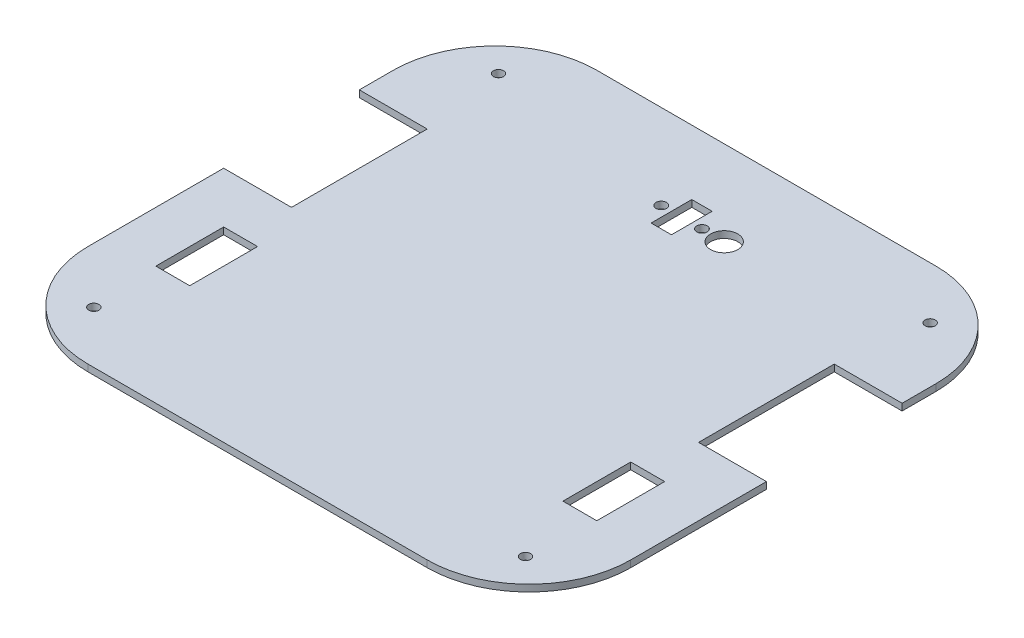
ISO-10303-21;
HEADER;
FILE_DESCRIPTION(('STEP AP214'),'2;1');
FILE_NAME('part.step','',(''),(''),'','','');
FILE_SCHEMA(('AUTOMOTIVE_DESIGN { 1 0 10303 214 1 1 1 1 }'));
ENDSEC;
DATA;
#1=APPLICATION_CONTEXT('core data for automotive mechanical design processes');
#2=APPLICATION_PROTOCOL_DEFINITION('international standard','automotive_design',2000,#1);
#3=PRODUCT_CONTEXT('',#1,'mechanical');
#4=PRODUCT('Part','Part','',(#3));
#5=PRODUCT_RELATED_PRODUCT_CATEGORY('part','',(#4));
#6=PRODUCT_DEFINITION_FORMATION('','',#4);
#7=PRODUCT_DEFINITION_CONTEXT('part definition',#1,'design');
#8=PRODUCT_DEFINITION('design','',#6,#7);
#9=PRODUCT_DEFINITION_SHAPE('','',#8);
#10=(LENGTH_UNIT() NAMED_UNIT(*) SI_UNIT(.MILLI.,.METRE.));
#11=(NAMED_UNIT(*) PLANE_ANGLE_UNIT() SI_UNIT($,.RADIAN.));
#12=(NAMED_UNIT(*) SI_UNIT($,.STERADIAN.) SOLID_ANGLE_UNIT());
#13=UNCERTAINTY_MEASURE_WITH_UNIT(LENGTH_MEASURE(1.E-05),#10,'distance_accuracy_value','');
#14=(GEOMETRIC_REPRESENTATION_CONTEXT(3) GLOBAL_UNCERTAINTY_ASSIGNED_CONTEXT((#13)) GLOBAL_UNIT_ASSIGNED_CONTEXT((#10,
#11,#12)) REPRESENTATION_CONTEXT('',''));
#15=CARTESIAN_POINT('',(0.,0.,0.));
#16=DIRECTION('',(0.,0.,1.));
#17=DIRECTION('',(1.,0.,0.));
#18=AXIS2_PLACEMENT_3D('',#15,#16,#17);
#19=CARTESIAN_POINT('',(50.,2.,45.));
#20=DIRECTION('',(0.,1.,0.));
#21=DIRECTION('',(0.,0.,1.));
#22=AXIS2_PLACEMENT_3D('',#19,#20,#21);
#23=PLANE('',#22);
#24=DIRECTION('',(0.,0.,-1.));
#25=VECTOR('',#24,1.);
#26=CARTESIAN_POINT('',(-55.,2.,20.));
#27=LINE('',#26,#25);
#28=CARTESIAN_POINT('',(-55.,2.,40.));
#29=VERTEX_POINT('',#28);
#30=CARTESIAN_POINT('',(-55.,2.,20.));
#31=VERTEX_POINT('',#30);
#32=EDGE_CURVE('E64',#29,#31,#27,.T.);
#33=ORIENTED_EDGE('',*,*,#32,.F.);
#34=DIRECTION('',(1.,0.,0.));
#35=VECTOR('',#34,1.);
#36=CARTESIAN_POINT('',(-65.,2.,40.));
#37=LINE('',#36,#35);
#38=CARTESIAN_POINT('',(-65.,2.,40.));
#39=VERTEX_POINT('',#38);
#40=EDGE_CURVE('E259',#39,#29,#37,.T.);
#41=ORIENTED_EDGE('',*,*,#40,.F.);
#42=DIRECTION('',(0.,0.,1.));
#43=VECTOR('',#42,1.);
#44=CARTESIAN_POINT('',(-65.,2.,20.));
#45=LINE('',#44,#43);
#46=CARTESIAN_POINT('',(-65.,2.,20.));
#47=VERTEX_POINT('',#46);
#48=EDGE_CURVE('E241',#47,#39,#45,.T.);
#49=ORIENTED_EDGE('',*,*,#48,.F.);
#50=DIRECTION('',(-1.,0.,0.));
#51=VECTOR('',#50,1.);
#52=CARTESIAN_POINT('',(-65.,2.,20.));
#53=LINE('',#52,#51);
#54=EDGE_CURVE('E252',#31,#47,#53,.T.);
#55=ORIENTED_EDGE('',*,*,#54,.F.);
#56=EDGE_LOOP('',(#33,#41,#49,#55));
#57=FACE_BOUND('',#56,.T.);
#58=DIRECTION('',(0.,0.,-1.));
#59=VECTOR('',#58,1.);
#60=CARTESIAN_POINT('',(65.,2.,20.));
#61=LINE('',#60,#59);
#62=CARTESIAN_POINT('',(65.,2.,40.));
#63=VERTEX_POINT('',#62);
#64=CARTESIAN_POINT('',(65.,2.,20.));
#65=VERTEX_POINT('',#64);
#66=EDGE_CURVE('E72',#63,#65,#61,.T.);
#67=ORIENTED_EDGE('',*,*,#66,.F.);
#68=DIRECTION('',(1.,0.,0.));
#69=VECTOR('',#68,1.);
#70=CARTESIAN_POINT('',(65.,2.,40.));
#71=LINE('',#70,#69);
#72=CARTESIAN_POINT('',(55.,2.,40.));
#73=VERTEX_POINT('',#72);
#74=EDGE_CURVE('E277',#73,#63,#71,.T.);
#75=ORIENTED_EDGE('',*,*,#74,.F.);
#76=DIRECTION('',(0.,0.,1.));
#77=VECTOR('',#76,1.);
#78=CARTESIAN_POINT('',(55.,2.,20.));
#79=LINE('',#78,#77);
#80=CARTESIAN_POINT('',(55.,2.,20.));
#81=VERTEX_POINT('',#80);
#82=EDGE_CURVE('E290',#81,#73,#79,.T.);
#83=ORIENTED_EDGE('',*,*,#82,.F.);
#84=DIRECTION('',(-1.,0.,0.));
#85=VECTOR('',#84,1.);
#86=CARTESIAN_POINT('',(65.,2.,20.));
#87=LINE('',#86,#85);
#88=EDGE_CURVE('E294',#65,#81,#87,.T.);
#89=ORIENTED_EDGE('',*,*,#88,.F.);
#90=EDGE_LOOP('',(#67,#75,#83,#89));
#91=FACE_BOUND('',#90,.T.);
#92=CARTESIAN_POINT('',(12.55,2.,-50.));
#93=DIRECTION('',(0.,1.,0.));
#94=DIRECTION('',(0.,0.,1.));
#95=AXIS2_PLACEMENT_3D('',#92,#93,#94);
#96=CIRCLE('',#95,4.);
#97=CARTESIAN_POINT('',(12.55,2.,-46.));
#98=VERTEX_POINT('',#97);
#99=EDGE_CURVE('E269',#98,#98,#96,.T.);
#100=ORIENTED_EDGE('',*,*,#99,.F.);
#101=EDGE_LOOP('',(#100));
#102=FACE_BOUND('',#101,.T.);
#103=CARTESIAN_POINT('',(6.,2.,-50.));
#104=DIRECTION('',(0.,1.,0.));
#105=DIRECTION('',(0.,0.,1.));
#106=AXIS2_PLACEMENT_3D('',#103,#104,#105);
#107=CIRCLE('',#106,1.55000000000001);
#108=CARTESIAN_POINT('',(6.,2.,-48.45));
#109=VERTEX_POINT('',#108);
#110=EDGE_CURVE('E305',#109,#109,#107,.T.);
#111=ORIENTED_EDGE('',*,*,#110,.F.);
#112=EDGE_LOOP('',(#111));
#113=FACE_BOUND('',#112,.T.);
#114=CARTESIAN_POINT('',(-6.,2.,-50.));
#115=DIRECTION('',(0.,1.,0.));
#116=DIRECTION('',(0.,0.,1.));
#117=AXIS2_PLACEMENT_3D('',#114,#115,#116);
#118=CIRCLE('',#117,1.55000000000001);
#119=CARTESIAN_POINT('',(-6.,2.,-48.45));
#120=VERTEX_POINT('',#119);
#121=EDGE_CURVE('E300',#120,#120,#118,.T.);
#122=ORIENTED_EDGE('',*,*,#121,.F.);
#123=EDGE_LOOP('',(#122));
#124=FACE_BOUND('',#123,.T.);
#125=CARTESIAN_POINT('',(63.6210271847258,2.,59.6447129856805));
#126=DIRECTION('',(0.,1.,0.));
#127=DIRECTION('',(0.,0.,1.));
#128=AXIS2_PLACEMENT_3D('',#125,#126,#127);
#129=CIRCLE('',#128,1.5);
#130=CARTESIAN_POINT('',(63.6210271847258,2.,61.1447129856805));
#131=VERTEX_POINT('',#130);
#132=EDGE_CURVE('E351',#131,#131,#129,.T.);
#133=ORIENTED_EDGE('',*,*,#132,.F.);
#134=EDGE_LOOP('',(#133));
#135=FACE_BOUND('',#134,.T.);
#136=CARTESIAN_POINT('',(-63.6210271847258,2.,-59.6447129856805));
#137=DIRECTION('',(0.,1.,0.));
#138=DIRECTION('',(0.,0.,1.));
#139=AXIS2_PLACEMENT_3D('',#136,#137,#138);
#140=CIRCLE('',#139,1.5);
#141=CARTESIAN_POINT('',(-63.6210271847258,2.,-58.1447129856805));
#142=VERTEX_POINT('',#141);
#143=EDGE_CURVE('E367',#142,#142,#140,.T.);
#144=ORIENTED_EDGE('',*,*,#143,.F.);
#145=EDGE_LOOP('',(#144));
#146=FACE_BOUND('',#145,.T.);
#147=CARTESIAN_POINT('',(50.,2.,45.));
#148=DIRECTION('',(0.,1.,0.));
#149=DIRECTION('',(0.,0.,1.));
#150=AXIS2_PLACEMENT_3D('',#147,#148,#149);
#151=CIRCLE('',#150,30.);
#152=CARTESIAN_POINT('',(49.9999999999998,2.,75.));
#153=VERTEX_POINT('',#152);
#154=CARTESIAN_POINT('',(80.,2.,44.9999999999998));
#155=VERTEX_POINT('',#154);
#156=EDGE_CURVE('E375',#153,#155,#151,.T.);
#157=ORIENTED_EDGE('',*,*,#156,.T.);
#158=DIRECTION('',(0.,0.,-1.));
#159=VECTOR('',#158,1.);
#160=CARTESIAN_POINT('',(80.,2.,44.9999999999998));
#161=LINE('',#160,#159);
#162=CARTESIAN_POINT('',(80.,2.,4.99999999999997));
#163=VERTEX_POINT('',#162);
#164=EDGE_CURVE('E379',#155,#163,#161,.T.);
#165=ORIENTED_EDGE('',*,*,#164,.T.);
#166=DIRECTION('',(-1.,0.,0.));
#167=VECTOR('',#166,1.);
#168=CARTESIAN_POINT('',(60.,2.,4.99999999999996));
#169=LINE('',#168,#167);
#170=CARTESIAN_POINT('',(60.,2.,4.99999999999996));
#171=VERTEX_POINT('',#170);
#172=EDGE_CURVE('E383',#163,#171,#169,.T.);
#173=ORIENTED_EDGE('',*,*,#172,.T.);
#174=DIRECTION('',(0.,0.,-1.));
#175=VECTOR('',#174,1.);
#176=CARTESIAN_POINT('',(60.,2.,-35.));
#177=LINE('',#176,#175);
#178=CARTESIAN_POINT('',(60.,2.,-35.));
#179=VERTEX_POINT('',#178);
#180=EDGE_CURVE('E386',#171,#179,#177,.T.);
#181=ORIENTED_EDGE('',*,*,#180,.T.);
#182=DIRECTION('',(1.,0.,0.));
#183=VECTOR('',#182,1.);
#184=CARTESIAN_POINT('',(80.,2.,-35.));
#185=LINE('',#184,#183);
#186=CARTESIAN_POINT('',(80.,2.,-35.));
#187=VERTEX_POINT('',#186);
#188=EDGE_CURVE('E389',#179,#187,#185,.T.);
#189=ORIENTED_EDGE('',*,*,#188,.T.);
#190=DIRECTION('',(0.,0.,-1.));
#191=VECTOR('',#190,1.);
#192=CARTESIAN_POINT('',(80.,2.,-35.));
#193=LINE('',#192,#191);
#194=CARTESIAN_POINT('',(80.,2.,-44.9999999999998));
#195=VERTEX_POINT('',#194);
#196=EDGE_CURVE('E392',#187,#195,#193,.T.);
#197=ORIENTED_EDGE('',*,*,#196,.T.);
#198=CARTESIAN_POINT('',(50.,2.,-45.));
#199=DIRECTION('',(0.,1.,0.));
#200=DIRECTION('',(0.,0.,-1.));
#201=AXIS2_PLACEMENT_3D('',#198,#199,#200);
#202=CIRCLE('',#201,30.);
#203=CARTESIAN_POINT('',(49.9999999999998,2.,-75.));
#204=VERTEX_POINT('',#203);
#205=EDGE_CURVE('E395',#195,#204,#202,.T.);
#206=ORIENTED_EDGE('',*,*,#205,.T.);
#207=DIRECTION('',(-1.,0.,0.));
#208=VECTOR('',#207,1.);
#209=CARTESIAN_POINT('',(-49.9999999999998,2.,-75.));
#210=LINE('',#209,#208);
#211=CARTESIAN_POINT('',(-50.,2.,-75.));
#212=VERTEX_POINT('',#211);
#213=EDGE_CURVE('E398',#204,#212,#210,.T.);
#214=ORIENTED_EDGE('',*,*,#213,.T.);
#215=CARTESIAN_POINT('',(-50.,2.,-45.));
#216=DIRECTION('',(0.,1.,0.));
#217=DIRECTION('',(0.,0.,-1.));
#218=AXIS2_PLACEMENT_3D('',#215,#216,#217);
#219=CIRCLE('',#218,30.);
#220=CARTESIAN_POINT('',(-80.,2.,-44.9999999999998));
#221=VERTEX_POINT('',#220);
#222=EDGE_CURVE('E401',#212,#221,#219,.T.);
#223=ORIENTED_EDGE('',*,*,#222,.T.);
#224=DIRECTION('',(0.,0.,1.));
#225=VECTOR('',#224,1.);
#226=CARTESIAN_POINT('',(-80.,2.,-35.));
#227=LINE('',#226,#225);
#228=CARTESIAN_POINT('',(-80.,2.,-35.));
#229=VERTEX_POINT('',#228);
#230=EDGE_CURVE('E404',#221,#229,#227,.T.);
#231=ORIENTED_EDGE('',*,*,#230,.T.);
#232=DIRECTION('',(1.,0.,0.));
#233=VECTOR('',#232,1.);
#234=CARTESIAN_POINT('',(-80.,2.,-35.));
#235=LINE('',#234,#233);
#236=CARTESIAN_POINT('',(-60.,2.,-35.));
#237=VERTEX_POINT('',#236);
#238=EDGE_CURVE('E407',#229,#237,#235,.T.);
#239=ORIENTED_EDGE('',*,*,#238,.T.);
#240=DIRECTION('',(0.,0.,1.));
#241=VECTOR('',#240,1.);
#242=CARTESIAN_POINT('',(-60.,2.,-35.));
#243=LINE('',#242,#241);
#244=CARTESIAN_POINT('',(-60.,2.,4.99999999999999));
#245=VERTEX_POINT('',#244);
#246=EDGE_CURVE('E410',#237,#245,#243,.T.);
#247=ORIENTED_EDGE('',*,*,#246,.T.);
#248=DIRECTION('',(-1.,0.,0.));
#249=VECTOR('',#248,1.);
#250=CARTESIAN_POINT('',(-60.,2.,4.99999999999999));
#251=LINE('',#250,#249);
#252=CARTESIAN_POINT('',(-80.,2.,4.99999999999999));
#253=VERTEX_POINT('',#252);
#254=EDGE_CURVE('E413',#245,#253,#251,.T.);
#255=ORIENTED_EDGE('',*,*,#254,.T.);
#256=DIRECTION('',(0.,0.,1.));
#257=VECTOR('',#256,1.);
#258=CARTESIAN_POINT('',(-80.,2.,44.9999999999998));
#259=LINE('',#258,#257);
#260=CARTESIAN_POINT('',(-80.,2.,44.9999999999998));
#261=VERTEX_POINT('',#260);
#262=EDGE_CURVE('E416',#253,#261,#259,.T.);
#263=ORIENTED_EDGE('',*,*,#262,.T.);
#264=CARTESIAN_POINT('',(-50.,2.,45.));
#265=DIRECTION('',(0.,1.,0.));
#266=DIRECTION('',(0.,0.,-1.));
#267=AXIS2_PLACEMENT_3D('',#264,#265,#266);
#268=CIRCLE('',#267,30.);
#269=CARTESIAN_POINT('',(-49.9999999999998,2.,75.));
#270=VERTEX_POINT('',#269);
#271=EDGE_CURVE('E419',#261,#270,#268,.T.);
#272=ORIENTED_EDGE('',*,*,#271,.T.);
#273=DIRECTION('',(1.,0.,0.));
#274=VECTOR('',#273,1.);
#275=CARTESIAN_POINT('',(-49.9999999999998,2.,75.));
#276=LINE('',#275,#274);
#277=EDGE_CURVE('E422',#270,#153,#276,.T.);
#278=ORIENTED_EDGE('',*,*,#277,.T.);
#279=EDGE_LOOP('',(#157,#165,#173,#181,#189,#197,#206,#214,#223,#231,#239,#247,#255,#263,#272,#278));
#280=FACE_BOUND('',#279,.T.);
#281=CARTESIAN_POINT('',(63.6210271847258,2.,-59.6447129856805));
#282=DIRECTION('',(0.,1.,0.));
#283=DIRECTION('',(0.,0.,-1.));
#284=AXIS2_PLACEMENT_3D('',#281,#282,#283);
#285=CIRCLE('',#284,1.5);
#286=CARTESIAN_POINT('',(63.6210271847258,2.,-61.1447129856805));
#287=VERTEX_POINT('',#286);
#288=EDGE_CURVE('E359',#287,#287,#285,.T.);
#289=ORIENTED_EDGE('',*,*,#288,.F.);
#290=EDGE_LOOP('',(#289));
#291=FACE_BOUND('',#290,.T.);
#292=CARTESIAN_POINT('',(-63.6210271847258,2.,59.6447129856805));
#293=DIRECTION('',(0.,1.,0.));
#294=DIRECTION('',(0.,0.,-1.));
#295=AXIS2_PLACEMENT_3D('',#292,#293,#294);
#296=CIRCLE('',#295,1.5);
#297=CARTESIAN_POINT('',(-63.6210271847258,2.,58.1447129856805));
#298=VERTEX_POINT('',#297);
#299=EDGE_CURVE('E341',#298,#298,#296,.T.);
#300=ORIENTED_EDGE('',*,*,#299,.F.);
#301=EDGE_LOOP('',(#300));
#302=FACE_BOUND('',#301,.T.);
#303=DIRECTION('',(1.,0.,0.));
#304=VECTOR('',#303,1.);
#305=CARTESIAN_POINT('',(0.,2.,-44.));
#306=LINE('',#305,#304);
#307=CARTESIAN_POINT('',(-3.,2.,-44.));
#308=VERTEX_POINT('',#307);
#309=CARTESIAN_POINT('',(3.,2.,-44.));
#310=VERTEX_POINT('',#309);
#311=EDGE_CURVE('E315',#308,#310,#306,.T.);
#312=ORIENTED_EDGE('',*,*,#311,.F.);
#313=DIRECTION('',(0.,0.,-1.));
#314=VECTOR('',#313,1.);
#315=CARTESIAN_POINT('',(-3.,2.,0.));
#316=LINE('',#315,#314);
#317=CARTESIAN_POINT('',(-3.,2.,-56.));
#318=VERTEX_POINT('',#317);
#319=EDGE_CURVE('E304',#308,#318,#316,.T.);
#320=ORIENTED_EDGE('',*,*,#319,.T.);
#321=DIRECTION('',(1.,0.,0.));
#322=VECTOR('',#321,1.);
#323=CARTESIAN_POINT('',(0.,2.,-56.));
#324=LINE('',#323,#322);
#325=CARTESIAN_POINT('',(3.,2.,-56.));
#326=VERTEX_POINT('',#325);
#327=EDGE_CURVE('E323',#318,#326,#324,.T.);
#328=ORIENTED_EDGE('',*,*,#327,.T.);
#329=DIRECTION('',(0.,0.,-1.));
#330=VECTOR('',#329,1.);
#331=CARTESIAN_POINT('',(3.,2.,0.));
#332=LINE('',#331,#330);
#333=EDGE_CURVE('E319',#310,#326,#332,.T.);
#334=ORIENTED_EDGE('',*,*,#333,.F.);
#335=EDGE_LOOP('',(#312,#320,#328,#334));
#336=FACE_BOUND('',#335,.T.);
#337=ADVANCED_FACE('F48',(#57,#91,#102,#113,#124,#135,#146,#280,#291,#302,#336),#23,.T.);
#338=CARTESIAN_POINT('',(50.,0.,45.));
#339=DIRECTION('',(0.,1.,0.));
#340=DIRECTION('',(0.,0.,1.));
#341=AXIS2_PLACEMENT_3D('',#338,#339,#340);
#342=PLANE('',#341);
#343=DIRECTION('',(1.,0.,0.));
#344=VECTOR('',#343,1.);
#345=CARTESIAN_POINT('',(50.,0.,40.));
#346=LINE('',#345,#344);
#347=CARTESIAN_POINT('',(-65.,0.,40.));
#348=VERTEX_POINT('',#347);
#349=CARTESIAN_POINT('',(-55.,0.,40.));
#350=VERTEX_POINT('',#349);
#351=EDGE_CURVE('E57',#348,#350,#346,.T.);
#352=ORIENTED_EDGE('',*,*,#351,.T.);
#353=DIRECTION('',(0.,0.,-1.));
#354=VECTOR('',#353,1.);
#355=CARTESIAN_POINT('',(-55.,0.,45.0000000000001));
#356=LINE('',#355,#354);
#357=CARTESIAN_POINT('',(-55.,0.,20.));
#358=VERTEX_POINT('',#357);
#359=EDGE_CURVE('E11',#350,#358,#356,.T.);
#360=ORIENTED_EDGE('',*,*,#359,.T.);
#361=DIRECTION('',(-1.,0.,0.));
#362=VECTOR('',#361,1.);
#363=CARTESIAN_POINT('',(50.,0.,20.));
#364=LINE('',#363,#362);
#365=CARTESIAN_POINT('',(-65.,0.,20.));
#366=VERTEX_POINT('',#365);
#367=EDGE_CURVE('E576',#358,#366,#364,.T.);
#368=ORIENTED_EDGE('',*,*,#367,.T.);
#369=DIRECTION('',(0.,0.,1.));
#370=VECTOR('',#369,1.);
#371=CARTESIAN_POINT('',(-65.,0.,45.));
#372=LINE('',#371,#370);
#373=EDGE_CURVE('E244',#366,#348,#372,.T.);
#374=ORIENTED_EDGE('',*,*,#373,.T.);
#375=EDGE_LOOP('',(#352,#360,#368,#374));
#376=FACE_BOUND('',#375,.T.);
#377=DIRECTION('',(1.,0.,0.));
#378=VECTOR('',#377,1.);
#379=CARTESIAN_POINT('',(50.,0.,40.));
#380=LINE('',#379,#378);
#381=CARTESIAN_POINT('',(55.,0.,40.));
#382=VERTEX_POINT('',#381);
#383=CARTESIAN_POINT('',(65.,0.,40.));
#384=VERTEX_POINT('',#383);
#385=EDGE_CURVE('E568',#382,#384,#380,.T.);
#386=ORIENTED_EDGE('',*,*,#385,.T.);
#387=DIRECTION('',(0.,0.,-1.));
#388=VECTOR('',#387,1.);
#389=CARTESIAN_POINT('',(65.,0.,45.));
#390=LINE('',#389,#388);
#391=CARTESIAN_POINT('',(65.,0.,20.));
#392=VERTEX_POINT('',#391);
#393=EDGE_CURVE('E572',#384,#392,#390,.T.);
#394=ORIENTED_EDGE('',*,*,#393,.T.);
#395=DIRECTION('',(-1.,0.,0.));
#396=VECTOR('',#395,1.);
#397=CARTESIAN_POINT('',(50.,0.,20.));
#398=LINE('',#397,#396);
#399=CARTESIAN_POINT('',(55.,0.,20.));
#400=VERTEX_POINT('',#399);
#401=EDGE_CURVE('E550',#392,#400,#398,.T.);
#402=ORIENTED_EDGE('',*,*,#401,.T.);
#403=DIRECTION('',(0.,0.,1.));
#404=VECTOR('',#403,1.);
#405=CARTESIAN_POINT('',(55.,0.,45.));
#406=LINE('',#405,#404);
#407=EDGE_CURVE('E564',#400,#382,#406,.T.);
#408=ORIENTED_EDGE('',*,*,#407,.T.);
#409=EDGE_LOOP('',(#386,#394,#402,#408));
#410=FACE_BOUND('',#409,.T.);
#411=CARTESIAN_POINT('',(12.55,0.,-50.));
#412=DIRECTION('',(0.,1.,0.));
#413=DIRECTION('',(0.,0.,1.));
#414=AXIS2_PLACEMENT_3D('',#411,#412,#413);
#415=CIRCLE('',#414,4.);
#416=CARTESIAN_POINT('',(12.55,0.,-46.));
#417=VERTEX_POINT('',#416);
#418=EDGE_CURVE('E350',#417,#417,#415,.T.);
#419=ORIENTED_EDGE('',*,*,#418,.T.);
#420=EDGE_LOOP('',(#419));
#421=FACE_BOUND('',#420,.T.);
#422=CARTESIAN_POINT('',(6.,0.,-50.));
#423=DIRECTION('',(0.,1.,0.));
#424=DIRECTION('',(0.,0.,1.));
#425=AXIS2_PLACEMENT_3D('',#422,#423,#424);
#426=CIRCLE('',#425,1.55000000000001);
#427=CARTESIAN_POINT('',(6.,0.,-48.45));
#428=VERTEX_POINT('',#427);
#429=EDGE_CURVE('E554',#428,#428,#426,.T.);
#430=ORIENTED_EDGE('',*,*,#429,.T.);
#431=EDGE_LOOP('',(#430));
#432=FACE_BOUND('',#431,.T.);
#433=CARTESIAN_POINT('',(-6.,0.,-50.));
#434=DIRECTION('',(0.,1.,0.));
#435=DIRECTION('',(0.,0.,1.));
#436=AXIS2_PLACEMENT_3D('',#433,#434,#435);
#437=CIRCLE('',#436,1.55000000000001);
#438=CARTESIAN_POINT('',(-6.,0.,-48.45));
#439=VERTEX_POINT('',#438);
#440=EDGE_CURVE('E331',#439,#439,#437,.T.);
#441=ORIENTED_EDGE('',*,*,#440,.T.);
#442=EDGE_LOOP('',(#441));
#443=FACE_BOUND('',#442,.T.);
#444=CARTESIAN_POINT('',(-63.6210271847258,0.,59.6447129856805));
#445=DIRECTION('',(0.,1.,0.));
#446=DIRECTION('',(0.,0.,-1.));
#447=AXIS2_PLACEMENT_3D('',#444,#445,#446);
#448=CIRCLE('',#447,1.5);
#449=CARTESIAN_POINT('',(-63.6210271847258,0.,58.1447129856805));
#450=VERTEX_POINT('',#449);
#451=EDGE_CURVE('E346',#450,#450,#448,.T.);
#452=ORIENTED_EDGE('',*,*,#451,.T.);
#453=EDGE_LOOP('',(#452));
#454=FACE_BOUND('',#453,.T.);
#455=CARTESIAN_POINT('',(63.6210271847258,0.,59.6447129856805));
#456=DIRECTION('',(0.,1.,0.));
#457=DIRECTION('',(0.,0.,1.));
#458=AXIS2_PLACEMENT_3D('',#455,#456,#457);
#459=CIRCLE('',#458,1.5);
#460=CARTESIAN_POINT('',(63.6210271847258,0.,61.1447129856805));
#461=VERTEX_POINT('',#460);
#462=EDGE_CURVE('E345',#461,#461,#459,.T.);
#463=ORIENTED_EDGE('',*,*,#462,.T.);
#464=EDGE_LOOP('',(#463));
#465=FACE_BOUND('',#464,.T.);
#466=CARTESIAN_POINT('',(63.6210271847258,0.,-59.6447129856805));
#467=DIRECTION('',(0.,1.,0.));
#468=DIRECTION('',(0.,0.,-1.));
#469=AXIS2_PLACEMENT_3D('',#466,#467,#468);
#470=CIRCLE('',#469,1.5);
#471=CARTESIAN_POINT('',(63.6210271847258,0.,-61.1447129856805));
#472=VERTEX_POINT('',#471);
#473=EDGE_CURVE('E355',#472,#472,#470,.T.);
#474=ORIENTED_EDGE('',*,*,#473,.T.);
#475=EDGE_LOOP('',(#474));
#476=FACE_BOUND('',#475,.T.);
#477=CARTESIAN_POINT('',(-63.6210271847258,0.,-59.6447129856805));
#478=DIRECTION('',(0.,1.,0.));
#479=DIRECTION('',(0.,0.,1.));
#480=AXIS2_PLACEMENT_3D('',#477,#478,#479);
#481=CIRCLE('',#480,1.5);
#482=CARTESIAN_POINT('',(-63.6210271847258,0.,-58.1447129856805));
#483=VERTEX_POINT('',#482);
#484=EDGE_CURVE('E363',#483,#483,#481,.T.);
#485=ORIENTED_EDGE('',*,*,#484,.T.);
#486=EDGE_LOOP('',(#485));
#487=FACE_BOUND('',#486,.T.);
#488=CARTESIAN_POINT('',(50.,0.,45.));
#489=DIRECTION('',(0.,1.,0.));
#490=DIRECTION('',(0.,0.,1.));
#491=AXIS2_PLACEMENT_3D('',#488,#489,#490);
#492=CIRCLE('',#491,30.);
#493=CARTESIAN_POINT('',(49.9999999999998,0.,75.));
#494=VERTEX_POINT('',#493);
#495=CARTESIAN_POINT('',(80.,0.,44.9999999999998));
#496=VERTEX_POINT('',#495);
#497=EDGE_CURVE('E371',#494,#496,#492,.T.);
#498=ORIENTED_EDGE('',*,*,#497,.F.);
#499=DIRECTION('',(1.,0.,0.));
#500=VECTOR('',#499,1.);
#501=CARTESIAN_POINT('',(-49.9999999999998,0.,75.));
#502=LINE('',#501,#500);
#503=CARTESIAN_POINT('',(-49.9999999999998,0.,75.));
#504=VERTEX_POINT('',#503);
#505=EDGE_CURVE('E380',#504,#494,#502,.T.);
#506=ORIENTED_EDGE('',*,*,#505,.F.);
#507=CARTESIAN_POINT('',(-50.,0.,45.));
#508=DIRECTION('',(0.,1.,0.));
#509=DIRECTION('',(0.,0.,-1.));
#510=AXIS2_PLACEMENT_3D('',#507,#508,#509);
#511=CIRCLE('',#510,30.);
#512=CARTESIAN_POINT('',(-80.,0.,44.9999999999998));
#513=VERTEX_POINT('',#512);
#514=EDGE_CURVE('E468',#513,#504,#511,.T.);
#515=ORIENTED_EDGE('',*,*,#514,.F.);
#516=DIRECTION('',(0.,0.,1.));
#517=VECTOR('',#516,1.);
#518=CARTESIAN_POINT('',(-80.,0.,44.9999999999998));
#519=LINE('',#518,#517);
#520=CARTESIAN_POINT('',(-80.,0.,4.99999999999999));
#521=VERTEX_POINT('',#520);
#522=EDGE_CURVE('E465',#521,#513,#519,.T.);
#523=ORIENTED_EDGE('',*,*,#522,.F.);
#524=DIRECTION('',(-1.,0.,0.));
#525=VECTOR('',#524,1.);
#526=CARTESIAN_POINT('',(-60.,0.,4.99999999999999));
#527=LINE('',#526,#525);
#528=CARTESIAN_POINT('',(-60.,0.,4.99999999999999));
#529=VERTEX_POINT('',#528);
#530=EDGE_CURVE('E462',#529,#521,#527,.T.);
#531=ORIENTED_EDGE('',*,*,#530,.F.);
#532=DIRECTION('',(0.,0.,1.));
#533=VECTOR('',#532,1.);
#534=CARTESIAN_POINT('',(-60.,0.,-35.));
#535=LINE('',#534,#533);
#536=CARTESIAN_POINT('',(-60.,0.,-35.));
#537=VERTEX_POINT('',#536);
#538=EDGE_CURVE('E459',#537,#529,#535,.T.);
#539=ORIENTED_EDGE('',*,*,#538,.F.);
#540=DIRECTION('',(1.,0.,0.));
#541=VECTOR('',#540,1.);
#542=CARTESIAN_POINT('',(-80.,0.,-35.));
#543=LINE('',#542,#541);
#544=CARTESIAN_POINT('',(-80.,0.,-35.));
#545=VERTEX_POINT('',#544);
#546=EDGE_CURVE('E456',#545,#537,#543,.T.);
#547=ORIENTED_EDGE('',*,*,#546,.F.);
#548=DIRECTION('',(0.,0.,1.));
#549=VECTOR('',#548,1.);
#550=CARTESIAN_POINT('',(-80.,0.,-35.));
#551=LINE('',#550,#549);
#552=CARTESIAN_POINT('',(-80.,0.,-44.9999999999998));
#553=VERTEX_POINT('',#552);
#554=EDGE_CURVE('E453',#553,#545,#551,.T.);
#555=ORIENTED_EDGE('',*,*,#554,.F.);
#556=CARTESIAN_POINT('',(-50.,0.,-45.));
#557=DIRECTION('',(0.,1.,0.));
#558=DIRECTION('',(0.,0.,-1.));
#559=AXIS2_PLACEMENT_3D('',#556,#557,#558);
#560=CIRCLE('',#559,30.);
#561=CARTESIAN_POINT('',(-50.,0.,-75.));
#562=VERTEX_POINT('',#561);
#563=EDGE_CURVE('E450',#562,#553,#560,.T.);
#564=ORIENTED_EDGE('',*,*,#563,.F.);
#565=DIRECTION('',(-1.,0.,0.));
#566=VECTOR('',#565,1.);
#567=CARTESIAN_POINT('',(-49.9999999999998,0.,-75.));
#568=LINE('',#567,#566);
#569=CARTESIAN_POINT('',(49.9999999999998,0.,-75.));
#570=VERTEX_POINT('',#569);
#571=EDGE_CURVE('E447',#570,#562,#568,.T.);
#572=ORIENTED_EDGE('',*,*,#571,.F.);
#573=CARTESIAN_POINT('',(50.,0.,-45.));
#574=DIRECTION('',(0.,1.,0.));
#575=DIRECTION('',(0.,0.,-1.));
#576=AXIS2_PLACEMENT_3D('',#573,#574,#575);
#577=CIRCLE('',#576,30.);
#578=CARTESIAN_POINT('',(80.,0.,-44.9999999999998));
#579=VERTEX_POINT('',#578);
#580=EDGE_CURVE('E444',#579,#570,#577,.T.);
#581=ORIENTED_EDGE('',*,*,#580,.F.);
#582=DIRECTION('',(0.,0.,-1.));
#583=VECTOR('',#582,1.);
#584=CARTESIAN_POINT('',(80.,0.,-35.));
#585=LINE('',#584,#583);
#586=CARTESIAN_POINT('',(80.,0.,-35.));
#587=VERTEX_POINT('',#586);
#588=EDGE_CURVE('E441',#587,#579,#585,.T.);
#589=ORIENTED_EDGE('',*,*,#588,.F.);
#590=DIRECTION('',(1.,0.,0.));
#591=VECTOR('',#590,1.);
#592=CARTESIAN_POINT('',(80.,0.,-35.));
#593=LINE('',#592,#591);
#594=CARTESIAN_POINT('',(60.,0.,-35.));
#595=VERTEX_POINT('',#594);
#596=EDGE_CURVE('E438',#595,#587,#593,.T.);
#597=ORIENTED_EDGE('',*,*,#596,.F.);
#598=DIRECTION('',(0.,0.,-1.));
#599=VECTOR('',#598,1.);
#600=CARTESIAN_POINT('',(60.,0.,-35.));
#601=LINE('',#600,#599);
#602=CARTESIAN_POINT('',(60.,0.,4.99999999999996));
#603=VERTEX_POINT('',#602);
#604=EDGE_CURVE('E435',#603,#595,#601,.T.);
#605=ORIENTED_EDGE('',*,*,#604,.F.);
#606=DIRECTION('',(-1.,0.,0.));
#607=VECTOR('',#606,1.);
#608=CARTESIAN_POINT('',(60.,0.,4.99999999999996));
#609=LINE('',#608,#607);
#610=CARTESIAN_POINT('',(80.,0.,4.99999999999997));
#611=VERTEX_POINT('',#610);
#612=EDGE_CURVE('E432',#611,#603,#609,.T.);
#613=ORIENTED_EDGE('',*,*,#612,.F.);
#614=DIRECTION('',(0.,0.,-1.));
#615=VECTOR('',#614,1.);
#616=CARTESIAN_POINT('',(80.,0.,44.9999999999998));
#617=LINE('',#616,#615);
#618=EDGE_CURVE('E429',#496,#611,#617,.T.);
#619=ORIENTED_EDGE('',*,*,#618,.F.);
#620=EDGE_LOOP('',(#498,#506,#515,#523,#531,#539,#547,#555,#564,#572,#581,#589,#597,#605,#613,#619));
#621=FACE_BOUND('',#620,.T.);
#622=DIRECTION('',(0.,0.,-1.));
#623=VECTOR('',#622,1.);
#624=CARTESIAN_POINT('',(-3.,0.,45.));
#625=LINE('',#624,#623);
#626=CARTESIAN_POINT('',(-3.,0.,-44.));
#627=VERTEX_POINT('',#626);
#628=CARTESIAN_POINT('',(-3.,0.,-56.));
#629=VERTEX_POINT('',#628);
#630=EDGE_CURVE('E547',#627,#629,#625,.T.);
#631=ORIENTED_EDGE('',*,*,#630,.F.);
#632=DIRECTION('',(1.,0.,0.));
#633=VECTOR('',#632,1.);
#634=CARTESIAN_POINT('',(50.,0.,-44.));
#635=LINE('',#634,#633);
#636=CARTESIAN_POINT('',(3.,0.,-44.));
#637=VERTEX_POINT('',#636);
#638=EDGE_CURVE('E536',#627,#637,#635,.T.);
#639=ORIENTED_EDGE('',*,*,#638,.T.);
#640=DIRECTION('',(0.,0.,-1.));
#641=VECTOR('',#640,1.);
#642=CARTESIAN_POINT('',(3.,0.,45.));
#643=LINE('',#642,#641);
#644=CARTESIAN_POINT('',(3.,0.,-56.));
#645=VERTEX_POINT('',#644);
#646=EDGE_CURVE('E540',#637,#645,#643,.T.);
#647=ORIENTED_EDGE('',*,*,#646,.T.);
#648=DIRECTION('',(1.,0.,0.));
#649=VECTOR('',#648,1.);
#650=CARTESIAN_POINT('',(50.,0.,-56.));
#651=LINE('',#650,#649);
#652=EDGE_CURVE('E544',#629,#645,#651,.T.);
#653=ORIENTED_EDGE('',*,*,#652,.F.);
#654=EDGE_LOOP('',(#631,#639,#647,#653));
#655=FACE_BOUND('',#654,.T.);
#656=ADVANCED_FACE('F583',(#376,#410,#421,#432,#443,#454,#465,#476,#487,#621,#655),#342,.F.);
#657=CARTESIAN_POINT('',(50.,2.,45.));
#658=DIRECTION('',(0.,-1.,0.));
#659=DIRECTION('',(0.,0.,-1.));
#660=AXIS2_PLACEMENT_3D('',#657,#658,#659);
#661=CYLINDRICAL_SURFACE('',#660,30.);
#662=ORIENTED_EDGE('',*,*,#497,.T.);
#663=DIRECTION('',(0.,-1.,0.));
#664=VECTOR('',#663,1.);
#665=CARTESIAN_POINT('',(80.,2.,44.9999999999998));
#666=LINE('',#665,#664);
#667=EDGE_CURVE('E532',#155,#496,#666,.T.);
#668=ORIENTED_EDGE('',*,*,#667,.F.);
#669=ORIENTED_EDGE('',*,*,#156,.F.);
#670=DIRECTION('',(0.,-1.,0.));
#671=VECTOR('',#670,1.);
#672=CARTESIAN_POINT('',(49.9999999999998,2.,75.));
#673=LINE('',#672,#671);
#674=EDGE_CURVE('E425',#153,#494,#673,.T.);
#675=ORIENTED_EDGE('',*,*,#674,.T.);
#676=EDGE_LOOP('',(#662,#668,#669,#675));
#677=FACE_BOUND('',#676,.T.);
#678=ADVANCED_FACE('F50',(#677),#661,.T.);
#679=CARTESIAN_POINT('',(80.,2.,44.9999999999998));
#680=DIRECTION('',(-1.,0.,0.));
#681=DIRECTION('',(0.,0.,1.));
#682=AXIS2_PLACEMENT_3D('',#679,#680,#681);
#683=PLANE('',#682);
#684=ORIENTED_EDGE('',*,*,#618,.T.);
#685=DIRECTION('',(0.,-1.,0.));
#686=VECTOR('',#685,1.);
#687=CARTESIAN_POINT('',(80.,2.,4.99999999999997));
#688=LINE('',#687,#686);
#689=EDGE_CURVE('E528',#163,#611,#688,.T.);
#690=ORIENTED_EDGE('',*,*,#689,.F.);
#691=ORIENTED_EDGE('',*,*,#164,.F.);
#692=ORIENTED_EDGE('',*,*,#667,.T.);
#693=EDGE_LOOP('',(#684,#690,#691,#692));
#694=FACE_BOUND('',#693,.T.);
#695=ADVANCED_FACE('F667',(#694),#683,.F.);
#696=CARTESIAN_POINT('',(60.,2.,4.99999999999996));
#697=DIRECTION('',(0.,0.,1.));
#698=DIRECTION('',(1.,0.,0.));
#699=AXIS2_PLACEMENT_3D('',#696,#697,#698);
#700=PLANE('',#699);
#701=ORIENTED_EDGE('',*,*,#612,.T.);
#702=DIRECTION('',(0.,-1.,0.));
#703=VECTOR('',#702,1.);
#704=CARTESIAN_POINT('',(60.,2.,4.99999999999996));
#705=LINE('',#704,#703);
#706=EDGE_CURVE('E524',#171,#603,#705,.T.);
#707=ORIENTED_EDGE('',*,*,#706,.F.);
#708=ORIENTED_EDGE('',*,*,#172,.F.);
#709=ORIENTED_EDGE('',*,*,#689,.T.);
#710=EDGE_LOOP('',(#701,#707,#708,#709));
#711=FACE_BOUND('',#710,.T.);
#712=ADVANCED_FACE('F664',(#711),#700,.F.);
#713=CARTESIAN_POINT('',(60.,2.,-35.));
#714=DIRECTION('',(-1.,0.,0.));
#715=DIRECTION('',(0.,0.,1.));
#716=AXIS2_PLACEMENT_3D('',#713,#714,#715);
#717=PLANE('',#716);
#718=ORIENTED_EDGE('',*,*,#604,.T.);
#719=DIRECTION('',(0.,-1.,0.));
#720=VECTOR('',#719,1.);
#721=CARTESIAN_POINT('',(60.,2.,-35.));
#722=LINE('',#721,#720);
#723=EDGE_CURVE('E520',#179,#595,#722,.T.);
#724=ORIENTED_EDGE('',*,*,#723,.F.);
#725=ORIENTED_EDGE('',*,*,#180,.F.);
#726=ORIENTED_EDGE('',*,*,#706,.T.);
#727=EDGE_LOOP('',(#718,#724,#725,#726));
#728=FACE_BOUND('',#727,.T.);
#729=ADVANCED_FACE('F660',(#728),#717,.F.);
#730=CARTESIAN_POINT('',(80.,2.,-35.));
#731=DIRECTION('',(0.,0.,-1.));
#732=DIRECTION('',(-1.,0.,0.));
#733=AXIS2_PLACEMENT_3D('',#730,#731,#732);
#734=PLANE('',#733);
#735=ORIENTED_EDGE('',*,*,#596,.T.);
#736=DIRECTION('',(0.,-1.,0.));
#737=VECTOR('',#736,1.);
#738=CARTESIAN_POINT('',(80.,2.,-35.));
#739=LINE('',#738,#737);
#740=EDGE_CURVE('E516',#187,#587,#739,.T.);
#741=ORIENTED_EDGE('',*,*,#740,.F.);
#742=ORIENTED_EDGE('',*,*,#188,.F.);
#743=ORIENTED_EDGE('',*,*,#723,.T.);
#744=EDGE_LOOP('',(#735,#741,#742,#743));
#745=FACE_BOUND('',#744,.T.);
#746=ADVANCED_FACE('F656',(#745),#734,.F.);
#747=CARTESIAN_POINT('',(80.,2.,-35.));
#748=DIRECTION('',(-1.,0.,0.));
#749=DIRECTION('',(0.,0.,1.));
#750=AXIS2_PLACEMENT_3D('',#747,#748,#749);
#751=PLANE('',#750);
#752=ORIENTED_EDGE('',*,*,#588,.T.);
#753=DIRECTION('',(0.,-1.,0.));
#754=VECTOR('',#753,1.);
#755=CARTESIAN_POINT('',(80.,2.,-44.9999999999998));
#756=LINE('',#755,#754);
#757=EDGE_CURVE('E512',#195,#579,#756,.T.);
#758=ORIENTED_EDGE('',*,*,#757,.F.);
#759=ORIENTED_EDGE('',*,*,#196,.F.);
#760=ORIENTED_EDGE('',*,*,#740,.T.);
#761=EDGE_LOOP('',(#752,#758,#759,#760));
#762=FACE_BOUND('',#761,.T.);
#763=ADVANCED_FACE('F652',(#762),#751,.F.);
#764=CARTESIAN_POINT('',(50.,2.,-45.));
#765=DIRECTION('',(0.,-1.,0.));
#766=DIRECTION('',(0.,0.,-1.));
#767=AXIS2_PLACEMENT_3D('',#764,#765,#766);
#768=CYLINDRICAL_SURFACE('',#767,30.);
#769=ORIENTED_EDGE('',*,*,#580,.T.);
#770=DIRECTION('',(0.,-1.,0.));
#771=VECTOR('',#770,1.);
#772=CARTESIAN_POINT('',(49.9999999999998,2.,-75.));
#773=LINE('',#772,#771);
#774=EDGE_CURVE('E508',#204,#570,#773,.T.);
#775=ORIENTED_EDGE('',*,*,#774,.F.);
#776=ORIENTED_EDGE('',*,*,#205,.F.);
#777=ORIENTED_EDGE('',*,*,#757,.T.);
#778=EDGE_LOOP('',(#769,#775,#776,#777));
#779=FACE_BOUND('',#778,.T.);
#780=ADVANCED_FACE('F648',(#779),#768,.T.);
#781=CARTESIAN_POINT('',(-49.9999999999998,2.,-75.));
#782=DIRECTION('',(0.,0.,1.));
#783=DIRECTION('',(1.,0.,0.));
#784=AXIS2_PLACEMENT_3D('',#781,#782,#783);
#785=PLANE('',#784);
#786=ORIENTED_EDGE('',*,*,#571,.T.);
#787=DIRECTION('',(0.,-1.,0.));
#788=VECTOR('',#787,1.);
#789=CARTESIAN_POINT('',(-50.,2.,-75.));
#790=LINE('',#789,#788);
#791=EDGE_CURVE('E504',#212,#562,#790,.T.);
#792=ORIENTED_EDGE('',*,*,#791,.F.);
#793=ORIENTED_EDGE('',*,*,#213,.F.);
#794=ORIENTED_EDGE('',*,*,#774,.T.);
#795=EDGE_LOOP('',(#786,#792,#793,#794));
#796=FACE_BOUND('',#795,.T.);
#797=ADVANCED_FACE('F644',(#796),#785,.F.);
#798=CARTESIAN_POINT('',(-50.,2.,-45.));
#799=DIRECTION('',(0.,-1.,0.));
#800=DIRECTION('',(0.,0.,-1.));
#801=AXIS2_PLACEMENT_3D('',#798,#799,#800);
#802=CYLINDRICAL_SURFACE('',#801,30.);
#803=ORIENTED_EDGE('',*,*,#563,.T.);
#804=DIRECTION('',(0.,-1.,0.));
#805=VECTOR('',#804,1.);
#806=CARTESIAN_POINT('',(-80.,2.,-44.9999999999998));
#807=LINE('',#806,#805);
#808=EDGE_CURVE('E500',#221,#553,#807,.T.);
#809=ORIENTED_EDGE('',*,*,#808,.F.);
#810=ORIENTED_EDGE('',*,*,#222,.F.);
#811=ORIENTED_EDGE('',*,*,#791,.T.);
#812=EDGE_LOOP('',(#803,#809,#810,#811));
#813=FACE_BOUND('',#812,.T.);
#814=ADVANCED_FACE('F640',(#813),#802,.T.);
#815=CARTESIAN_POINT('',(-80.,2.,-35.));
#816=DIRECTION('',(1.,0.,0.));
#817=DIRECTION('',(0.,0.,-1.));
#818=AXIS2_PLACEMENT_3D('',#815,#816,#817);
#819=PLANE('',#818);
#820=ORIENTED_EDGE('',*,*,#554,.T.);
#821=DIRECTION('',(0.,-1.,0.));
#822=VECTOR('',#821,1.);
#823=CARTESIAN_POINT('',(-80.,2.,-35.));
#824=LINE('',#823,#822);
#825=EDGE_CURVE('E496',#229,#545,#824,.T.);
#826=ORIENTED_EDGE('',*,*,#825,.F.);
#827=ORIENTED_EDGE('',*,*,#230,.F.);
#828=ORIENTED_EDGE('',*,*,#808,.T.);
#829=EDGE_LOOP('',(#820,#826,#827,#828));
#830=FACE_BOUND('',#829,.T.);
#831=ADVANCED_FACE('F636',(#830),#819,.F.);
#832=CARTESIAN_POINT('',(-80.,2.,-35.));
#833=DIRECTION('',(0.,0.,-1.));
#834=DIRECTION('',(-1.,0.,0.));
#835=AXIS2_PLACEMENT_3D('',#832,#833,#834);
#836=PLANE('',#835);
#837=ORIENTED_EDGE('',*,*,#546,.T.);
#838=DIRECTION('',(0.,-1.,0.));
#839=VECTOR('',#838,1.);
#840=CARTESIAN_POINT('',(-60.,2.,-35.));
#841=LINE('',#840,#839);
#842=EDGE_CURVE('E492',#237,#537,#841,.T.);
#843=ORIENTED_EDGE('',*,*,#842,.F.);
#844=ORIENTED_EDGE('',*,*,#238,.F.);
#845=ORIENTED_EDGE('',*,*,#825,.T.);
#846=EDGE_LOOP('',(#837,#843,#844,#845));
#847=FACE_BOUND('',#846,.T.);
#848=ADVANCED_FACE('F632',(#847),#836,.F.);
#849=CARTESIAN_POINT('',(-60.,2.,-35.));
#850=DIRECTION('',(1.,0.,0.));
#851=DIRECTION('',(0.,0.,-1.));
#852=AXIS2_PLACEMENT_3D('',#849,#850,#851);
#853=PLANE('',#852);
#854=ORIENTED_EDGE('',*,*,#538,.T.);
#855=DIRECTION('',(0.,-1.,0.));
#856=VECTOR('',#855,1.);
#857=CARTESIAN_POINT('',(-60.,2.,4.99999999999999));
#858=LINE('',#857,#856);
#859=EDGE_CURVE('E488',#245,#529,#858,.T.);
#860=ORIENTED_EDGE('',*,*,#859,.F.);
#861=ORIENTED_EDGE('',*,*,#246,.F.);
#862=ORIENTED_EDGE('',*,*,#842,.T.);
#863=EDGE_LOOP('',(#854,#860,#861,#862));
#864=FACE_BOUND('',#863,.T.);
#865=ADVANCED_FACE('F628',(#864),#853,.F.);
#866=CARTESIAN_POINT('',(-60.,2.,4.99999999999999));
#867=DIRECTION('',(0.,0.,1.));
#868=DIRECTION('',(1.,0.,0.));
#869=AXIS2_PLACEMENT_3D('',#866,#867,#868);
#870=PLANE('',#869);
#871=ORIENTED_EDGE('',*,*,#530,.T.);
#872=DIRECTION('',(0.,-1.,0.));
#873=VECTOR('',#872,1.);
#874=CARTESIAN_POINT('',(-80.,2.,4.99999999999999));
#875=LINE('',#874,#873);
#876=EDGE_CURVE('E484',#253,#521,#875,.T.);
#877=ORIENTED_EDGE('',*,*,#876,.F.);
#878=ORIENTED_EDGE('',*,*,#254,.F.);
#879=ORIENTED_EDGE('',*,*,#859,.T.);
#880=EDGE_LOOP('',(#871,#877,#878,#879));
#881=FACE_BOUND('',#880,.T.);
#882=ADVANCED_FACE('F624',(#881),#870,.F.);
#883=CARTESIAN_POINT('',(-80.,2.,44.9999999999998));
#884=DIRECTION('',(1.,0.,0.));
#885=DIRECTION('',(0.,0.,-1.));
#886=AXIS2_PLACEMENT_3D('',#883,#884,#885);
#887=PLANE('',#886);
#888=ORIENTED_EDGE('',*,*,#522,.T.);
#889=DIRECTION('',(0.,-1.,0.));
#890=VECTOR('',#889,1.);
#891=CARTESIAN_POINT('',(-80.,2.,44.9999999999998));
#892=LINE('',#891,#890);
#893=EDGE_CURVE('E480',#261,#513,#892,.T.);
#894=ORIENTED_EDGE('',*,*,#893,.F.);
#895=ORIENTED_EDGE('',*,*,#262,.F.);
#896=ORIENTED_EDGE('',*,*,#876,.T.);
#897=EDGE_LOOP('',(#888,#894,#895,#896));
#898=FACE_BOUND('',#897,.T.);
#899=ADVANCED_FACE('F620',(#898),#887,.F.);
#900=CARTESIAN_POINT('',(-50.,2.,45.));
#901=DIRECTION('',(0.,-1.,0.));
#902=DIRECTION('',(0.,0.,-1.));
#903=AXIS2_PLACEMENT_3D('',#900,#901,#902);
#904=CYLINDRICAL_SURFACE('',#903,30.);
#905=ORIENTED_EDGE('',*,*,#514,.T.);
#906=DIRECTION('',(0.,-1.,0.));
#907=VECTOR('',#906,1.);
#908=CARTESIAN_POINT('',(-49.9999999999998,2.,75.));
#909=LINE('',#908,#907);
#910=EDGE_CURVE('E476',#270,#504,#909,.T.);
#911=ORIENTED_EDGE('',*,*,#910,.F.);
#912=ORIENTED_EDGE('',*,*,#271,.F.);
#913=ORIENTED_EDGE('',*,*,#893,.T.);
#914=EDGE_LOOP('',(#905,#911,#912,#913));
#915=FACE_BOUND('',#914,.T.);
#916=ADVANCED_FACE('F616',(#915),#904,.T.);
#917=CARTESIAN_POINT('',(-49.9999999999998,2.,75.));
#918=DIRECTION('',(0.,0.,-1.));
#919=DIRECTION('',(-1.,0.,0.));
#920=AXIS2_PLACEMENT_3D('',#917,#918,#919);
#921=PLANE('',#920);
#922=ORIENTED_EDGE('',*,*,#505,.T.);
#923=ORIENTED_EDGE('',*,*,#674,.F.);
#924=ORIENTED_EDGE('',*,*,#277,.F.);
#925=ORIENTED_EDGE('',*,*,#910,.T.);
#926=EDGE_LOOP('',(#922,#923,#924,#925));
#927=FACE_BOUND('',#926,.T.);
#928=ADVANCED_FACE('F613',(#927),#921,.F.);
#929=CARTESIAN_POINT('',(-63.6210271847258,2.,-59.6447129856805));
#930=DIRECTION('',(0.,-1.,0.));
#931=DIRECTION('',(0.,0.,-1.));
#932=AXIS2_PLACEMENT_3D('',#929,#930,#931);
#933=CYLINDRICAL_SURFACE('',#932,1.5);
#934=ORIENTED_EDGE('',*,*,#143,.T.);
#935=EDGE_LOOP('',(#934));
#936=FACE_BOUND('',#935,.T.);
#937=ORIENTED_EDGE('',*,*,#484,.F.);
#938=EDGE_LOOP('',(#937));
#939=FACE_BOUND('',#938,.T.);
#940=ADVANCED_FACE('F610',(#936,#939),#933,.F.);
#941=CARTESIAN_POINT('',(63.6210271847258,2.,-59.6447129856805));
#942=DIRECTION('',(0.,-1.,0.));
#943=DIRECTION('',(0.,0.,-1.));
#944=AXIS2_PLACEMENT_3D('',#941,#942,#943);
#945=CYLINDRICAL_SURFACE('',#944,1.5);
#946=ORIENTED_EDGE('',*,*,#288,.T.);
#947=EDGE_LOOP('',(#946));
#948=FACE_BOUND('',#947,.T.);
#949=ORIENTED_EDGE('',*,*,#473,.F.);
#950=EDGE_LOOP('',(#949));
#951=FACE_BOUND('',#950,.T.);
#952=ADVANCED_FACE('F765',(#948,#951),#945,.F.);
#953=CARTESIAN_POINT('',(63.6210271847258,2.,59.6447129856805));
#954=DIRECTION('',(0.,-1.,0.));
#955=DIRECTION('',(0.,0.,-1.));
#956=AXIS2_PLACEMENT_3D('',#953,#954,#955);
#957=CYLINDRICAL_SURFACE('',#956,1.5);
#958=ORIENTED_EDGE('',*,*,#132,.T.);
#959=EDGE_LOOP('',(#958));
#960=FACE_BOUND('',#959,.T.);
#961=ORIENTED_EDGE('',*,*,#462,.F.);
#962=EDGE_LOOP('',(#961));
#963=FACE_BOUND('',#962,.T.);
#964=ADVANCED_FACE('F762',(#960,#963),#957,.F.);
#965=CARTESIAN_POINT('',(-63.6210271847258,2.,59.6447129856805));
#966=DIRECTION('',(0.,-1.,0.));
#967=DIRECTION('',(0.,0.,-1.));
#968=AXIS2_PLACEMENT_3D('',#965,#966,#967);
#969=CYLINDRICAL_SURFACE('',#968,1.5);
#970=ORIENTED_EDGE('',*,*,#299,.T.);
#971=EDGE_LOOP('',(#970));
#972=FACE_BOUND('',#971,.T.);
#973=ORIENTED_EDGE('',*,*,#451,.F.);
#974=EDGE_LOOP('',(#973));
#975=FACE_BOUND('',#974,.T.);
#976=ADVANCED_FACE('F759',(#972,#975),#969,.F.);
#977=CARTESIAN_POINT('',(-3.,-8.,0.));
#978=DIRECTION('',(1.,0.,0.));
#979=DIRECTION('',(0.,0.,-1.));
#980=AXIS2_PLACEMENT_3D('',#977,#978,#979);
#981=PLANE('',#980);
#982=ORIENTED_EDGE('',*,*,#630,.T.);
#983=DIRECTION('',(0.,1.,0.));
#984=VECTOR('',#983,1.);
#985=CARTESIAN_POINT('',(-3.,-8.,-56.));
#986=LINE('',#985,#984);
#987=EDGE_CURVE('E328',#629,#318,#986,.T.);
#988=ORIENTED_EDGE('',*,*,#987,.T.);
#989=ORIENTED_EDGE('',*,*,#319,.F.);
#990=DIRECTION('',(0.,1.,0.));
#991=VECTOR('',#990,1.);
#992=CARTESIAN_POINT('',(-3.,-8.,-44.));
#993=LINE('',#992,#991);
#994=EDGE_CURVE('E327',#627,#308,#993,.T.);
#995=ORIENTED_EDGE('',*,*,#994,.F.);
#996=EDGE_LOOP('',(#982,#988,#989,#995));
#997=FACE_BOUND('',#996,.T.);
#998=ADVANCED_FACE('F737',(#997),#981,.T.);
#999=CARTESIAN_POINT('',(0.,-8.,-56.));
#1000=DIRECTION('',(0.,0.,1.));
#1001=DIRECTION('',(1.,0.,0.));
#1002=AXIS2_PLACEMENT_3D('',#999,#1000,#1001);
#1003=PLANE('',#1002);
#1004=ORIENTED_EDGE('',*,*,#652,.T.);
#1005=DIRECTION('',(0.,1.,0.));
#1006=VECTOR('',#1005,1.);
#1007=CARTESIAN_POINT('',(3.,-8.,-56.));
#1008=LINE('',#1007,#1006);
#1009=EDGE_CURVE('E332',#645,#326,#1008,.T.);
#1010=ORIENTED_EDGE('',*,*,#1009,.T.);
#1011=ORIENTED_EDGE('',*,*,#327,.F.);
#1012=ORIENTED_EDGE('',*,*,#987,.F.);
#1013=EDGE_LOOP('',(#1004,#1010,#1011,#1012));
#1014=FACE_BOUND('',#1013,.T.);
#1015=ADVANCED_FACE('F742',(#1014),#1003,.T.);
#1016=CARTESIAN_POINT('',(3.,-8.,0.));
#1017=DIRECTION('',(1.,0.,0.));
#1018=DIRECTION('',(0.,0.,-1.));
#1019=AXIS2_PLACEMENT_3D('',#1016,#1017,#1018);
#1020=PLANE('',#1019);
#1021=DIRECTION('',(0.,1.,0.));
#1022=VECTOR('',#1021,1.);
#1023=CARTESIAN_POINT('',(3.,-8.,-44.));
#1024=LINE('',#1023,#1022);
#1025=EDGE_CURVE('E335',#637,#310,#1024,.T.);
#1026=ORIENTED_EDGE('',*,*,#1025,.T.);
#1027=ORIENTED_EDGE('',*,*,#333,.T.);
#1028=ORIENTED_EDGE('',*,*,#1009,.F.);
#1029=ORIENTED_EDGE('',*,*,#646,.F.);
#1030=EDGE_LOOP('',(#1026,#1027,#1028,#1029));
#1031=FACE_BOUND('',#1030,.T.);
#1032=ADVANCED_FACE('F745',(#1031),#1020,.F.);
#1033=CARTESIAN_POINT('',(0.,-8.,-44.));
#1034=DIRECTION('',(0.,0.,1.));
#1035=DIRECTION('',(1.,0.,0.));
#1036=AXIS2_PLACEMENT_3D('',#1033,#1034,#1035);
#1037=PLANE('',#1036);
#1038=ORIENTED_EDGE('',*,*,#994,.T.);
#1039=ORIENTED_EDGE('',*,*,#311,.T.);
#1040=ORIENTED_EDGE('',*,*,#1025,.F.);
#1041=ORIENTED_EDGE('',*,*,#638,.F.);
#1042=EDGE_LOOP('',(#1038,#1039,#1040,#1041));
#1043=FACE_BOUND('',#1042,.T.);
#1044=ADVANCED_FACE('F732',(#1043),#1037,.F.);
#1045=CARTESIAN_POINT('',(-6.,-8.,-50.));
#1046=DIRECTION('',(0.,1.,0.));
#1047=DIRECTION('',(0.,0.,1.));
#1048=AXIS2_PLACEMENT_3D('',#1045,#1046,#1047);
#1049=CYLINDRICAL_SURFACE('',#1048,1.55000000000001);
#1050=ORIENTED_EDGE('',*,*,#121,.T.);
#1051=EDGE_LOOP('',(#1050));
#1052=FACE_BOUND('',#1051,.T.);
#1053=ORIENTED_EDGE('',*,*,#440,.F.);
#1054=EDGE_LOOP('',(#1053));
#1055=FACE_BOUND('',#1054,.T.);
#1056=ADVANCED_FACE('F752',(#1052,#1055),#1049,.F.);
#1057=CARTESIAN_POINT('',(6.,-8.,-50.));
#1058=DIRECTION('',(0.,1.,0.));
#1059=DIRECTION('',(0.,0.,1.));
#1060=AXIS2_PLACEMENT_3D('',#1057,#1058,#1059);
#1061=CYLINDRICAL_SURFACE('',#1060,1.55000000000001);
#1062=ORIENTED_EDGE('',*,*,#110,.T.);
#1063=EDGE_LOOP('',(#1062));
#1064=FACE_BOUND('',#1063,.T.);
#1065=ORIENTED_EDGE('',*,*,#429,.F.);
#1066=EDGE_LOOP('',(#1065));
#1067=FACE_BOUND('',#1066,.T.);
#1068=ADVANCED_FACE('F930',(#1064,#1067),#1061,.F.);
#1069=CARTESIAN_POINT('',(12.55,-8.,-50.));
#1070=DIRECTION('',(0.,1.,0.));
#1071=DIRECTION('',(0.,0.,1.));
#1072=AXIS2_PLACEMENT_3D('',#1069,#1070,#1071);
#1073=CYLINDRICAL_SURFACE('',#1072,4.);
#1074=ORIENTED_EDGE('',*,*,#99,.T.);
#1075=EDGE_LOOP('',(#1074));
#1076=FACE_BOUND('',#1075,.T.);
#1077=ORIENTED_EDGE('',*,*,#418,.F.);
#1078=EDGE_LOOP('',(#1077));
#1079=FACE_BOUND('',#1078,.T.);
#1080=ADVANCED_FACE('F939',(#1076,#1079),#1073,.F.);
#1081=CARTESIAN_POINT('',(65.,-8.,20.));
#1082=DIRECTION('',(1.,0.,0.));
#1083=DIRECTION('',(0.,0.,-1.));
#1084=AXIS2_PLACEMENT_3D('',#1081,#1082,#1083);
#1085=PLANE('',#1084);
#1086=DIRECTION('',(0.,1.,0.));
#1087=VECTOR('',#1086,1.);
#1088=CARTESIAN_POINT('',(65.,-8.,40.));
#1089=LINE('',#1088,#1087);
#1090=EDGE_CURVE('E284',#384,#63,#1089,.T.);
#1091=ORIENTED_EDGE('',*,*,#1090,.T.);
#1092=ORIENTED_EDGE('',*,*,#66,.T.);
#1093=DIRECTION('',(0.,1.,0.));
#1094=VECTOR('',#1093,1.);
#1095=CARTESIAN_POINT('',(65.,-8.,20.));
#1096=LINE('',#1095,#1094);
#1097=EDGE_CURVE('E274',#392,#65,#1096,.T.);
#1098=ORIENTED_EDGE('',*,*,#1097,.F.);
#1099=ORIENTED_EDGE('',*,*,#393,.F.);
#1100=EDGE_LOOP('',(#1091,#1092,#1098,#1099));
#1101=FACE_BOUND('',#1100,.T.);
#1102=ADVANCED_FACE('F947',(#1101),#1085,.F.);
#1103=CARTESIAN_POINT('',(65.,-8.,40.));
#1104=DIRECTION('',(0.,0.,1.));
#1105=DIRECTION('',(1.,0.,0.));
#1106=AXIS2_PLACEMENT_3D('',#1103,#1104,#1105);
#1107=PLANE('',#1106);
#1108=DIRECTION('',(0.,1.,0.));
#1109=VECTOR('',#1108,1.);
#1110=CARTESIAN_POINT('',(55.,-8.,40.));
#1111=LINE('',#1110,#1109);
#1112=EDGE_CURVE('E281',#382,#73,#1111,.T.);
#1113=ORIENTED_EDGE('',*,*,#1112,.T.);
#1114=ORIENTED_EDGE('',*,*,#74,.T.);
#1115=ORIENTED_EDGE('',*,*,#1090,.F.);
#1116=ORIENTED_EDGE('',*,*,#385,.F.);
#1117=EDGE_LOOP('',(#1113,#1114,#1115,#1116));
#1118=FACE_BOUND('',#1117,.T.);
#1119=ADVANCED_FACE('F954',(#1118),#1107,.F.);
#1120=CARTESIAN_POINT('',(55.,-8.,20.));
#1121=DIRECTION('',(-1.,0.,0.));
#1122=DIRECTION('',(0.,0.,1.));
#1123=AXIS2_PLACEMENT_3D('',#1120,#1121,#1122);
#1124=PLANE('',#1123);
#1125=DIRECTION('',(0.,1.,0.));
#1126=VECTOR('',#1125,1.);
#1127=CARTESIAN_POINT('',(55.,-8.,20.));
#1128=LINE('',#1127,#1126);
#1129=EDGE_CURVE('E278',#400,#81,#1128,.T.);
#1130=ORIENTED_EDGE('',*,*,#1129,.T.);
#1131=ORIENTED_EDGE('',*,*,#82,.T.);
#1132=ORIENTED_EDGE('',*,*,#1112,.F.);
#1133=ORIENTED_EDGE('',*,*,#407,.F.);
#1134=EDGE_LOOP('',(#1130,#1131,#1132,#1133));
#1135=FACE_BOUND('',#1134,.T.);
#1136=ADVANCED_FACE('F597',(#1135),#1124,.F.);
#1137=CARTESIAN_POINT('',(65.,-8.,20.));
#1138=DIRECTION('',(0.,0.,-1.));
#1139=DIRECTION('',(-1.,0.,0.));
#1140=AXIS2_PLACEMENT_3D('',#1137,#1138,#1139);
#1141=PLANE('',#1140);
#1142=ORIENTED_EDGE('',*,*,#1097,.T.);
#1143=ORIENTED_EDGE('',*,*,#88,.T.);
#1144=ORIENTED_EDGE('',*,*,#1129,.F.);
#1145=ORIENTED_EDGE('',*,*,#401,.F.);
#1146=EDGE_LOOP('',(#1142,#1143,#1144,#1145));
#1147=FACE_BOUND('',#1146,.T.);
#1148=ADVANCED_FACE('F590',(#1147),#1141,.F.);
#1149=CARTESIAN_POINT('',(-55.,-8.,20.));
#1150=DIRECTION('',(1.,0.,0.));
#1151=DIRECTION('',(0.,0.,-1.));
#1152=AXIS2_PLACEMENT_3D('',#1149,#1150,#1151);
#1153=PLANE('',#1152);
#1154=DIRECTION('',(0.,1.,0.));
#1155=VECTOR('',#1154,1.);
#1156=CARTESIAN_POINT('',(-55.,-8.,40.));
#1157=LINE('',#1156,#1155);
#1158=EDGE_CURVE('E266',#350,#29,#1157,.T.);
#1159=ORIENTED_EDGE('',*,*,#1158,.T.);
#1160=ORIENTED_EDGE('',*,*,#32,.T.);
#1161=DIRECTION('',(0.,1.,0.));
#1162=VECTOR('',#1161,1.);
#1163=CARTESIAN_POINT('',(-55.,-8.,20.));
#1164=LINE('',#1163,#1162);
#1165=EDGE_CURVE('E249',#358,#31,#1164,.T.);
#1166=ORIENTED_EDGE('',*,*,#1165,.F.);
#1167=ORIENTED_EDGE('',*,*,#359,.F.);
#1168=EDGE_LOOP('',(#1159,#1160,#1166,#1167));
#1169=FACE_BOUND('',#1168,.T.);
#1170=ADVANCED_FACE('F588',(#1169),#1153,.F.);
#1171=CARTESIAN_POINT('',(-65.,-8.,40.));
#1172=DIRECTION('',(0.,0.,1.));
#1173=DIRECTION('',(1.,0.,0.));
#1174=AXIS2_PLACEMENT_3D('',#1171,#1172,#1173);
#1175=PLANE('',#1174);
#1176=DIRECTION('',(0.,1.,0.));
#1177=VECTOR('',#1176,1.);
#1178=CARTESIAN_POINT('',(-65.,-8.,40.));
#1179=LINE('',#1178,#1177);
#1180=EDGE_CURVE('E248',#348,#39,#1179,.T.);
#1181=ORIENTED_EDGE('',*,*,#1180,.T.);
#1182=ORIENTED_EDGE('',*,*,#40,.T.);
#1183=ORIENTED_EDGE('',*,*,#1158,.F.);
#1184=ORIENTED_EDGE('',*,*,#351,.F.);
#1185=EDGE_LOOP('',(#1181,#1182,#1183,#1184));
#1186=FACE_BOUND('',#1185,.T.);
#1187=ADVANCED_FACE('F587',(#1186),#1175,.F.);
#1188=CARTESIAN_POINT('',(-65.,-8.,20.));
#1189=DIRECTION('',(-1.,0.,0.));
#1190=DIRECTION('',(0.,0.,1.));
#1191=AXIS2_PLACEMENT_3D('',#1188,#1189,#1190);
#1192=PLANE('',#1191);
#1193=DIRECTION('',(0.,1.,0.));
#1194=VECTOR('',#1193,1.);
#1195=CARTESIAN_POINT('',(-65.,-8.,20.));
#1196=LINE('',#1195,#1194);
#1197=EDGE_CURVE('E236',#366,#47,#1196,.T.);
#1198=ORIENTED_EDGE('',*,*,#1197,.T.);
#1199=ORIENTED_EDGE('',*,*,#48,.T.);
#1200=ORIENTED_EDGE('',*,*,#1180,.F.);
#1201=ORIENTED_EDGE('',*,*,#373,.F.);
#1202=EDGE_LOOP('',(#1198,#1199,#1200,#1201));
#1203=FACE_BOUND('',#1202,.T.);
#1204=ADVANCED_FACE('F238',(#1203),#1192,.F.);
#1205=CARTESIAN_POINT('',(-65.,-8.,20.));
#1206=DIRECTION('',(0.,0.,-1.));
#1207=DIRECTION('',(-1.,0.,0.));
#1208=AXIS2_PLACEMENT_3D('',#1205,#1206,#1207);
#1209=PLANE('',#1208);
#1210=ORIENTED_EDGE('',*,*,#1165,.T.);
#1211=ORIENTED_EDGE('',*,*,#54,.T.);
#1212=ORIENTED_EDGE('',*,*,#1197,.F.);
#1213=ORIENTED_EDGE('',*,*,#367,.F.);
#1214=EDGE_LOOP('',(#1210,#1211,#1212,#1213));
#1215=FACE_BOUND('',#1214,.T.);
#1216=ADVANCED_FACE('F253',(#1215),#1209,.F.);
#1217=CLOSED_SHELL('',(#337,#656,#678,#695,#712,#729,#746,#763,#780,#797,#814,#831,#848,#865,
#882,#899,#916,#928,#940,#952,#964,#976,#998,#1015,#1032,#1044,#1056,#1068,#1080,#1102,#1119,
#1136,#1148,#1170,#1187,#1204,#1216));
#1218=MANIFOLD_SOLID_BREP('B2',#1217);
#1219=ADVANCED_BREP_SHAPE_REPRESENTATION('',(#18,#1218),#14);
#1220=SHAPE_DEFINITION_REPRESENTATION(#9,#1219);
ENDSEC;
END-ISO-10303-21;
